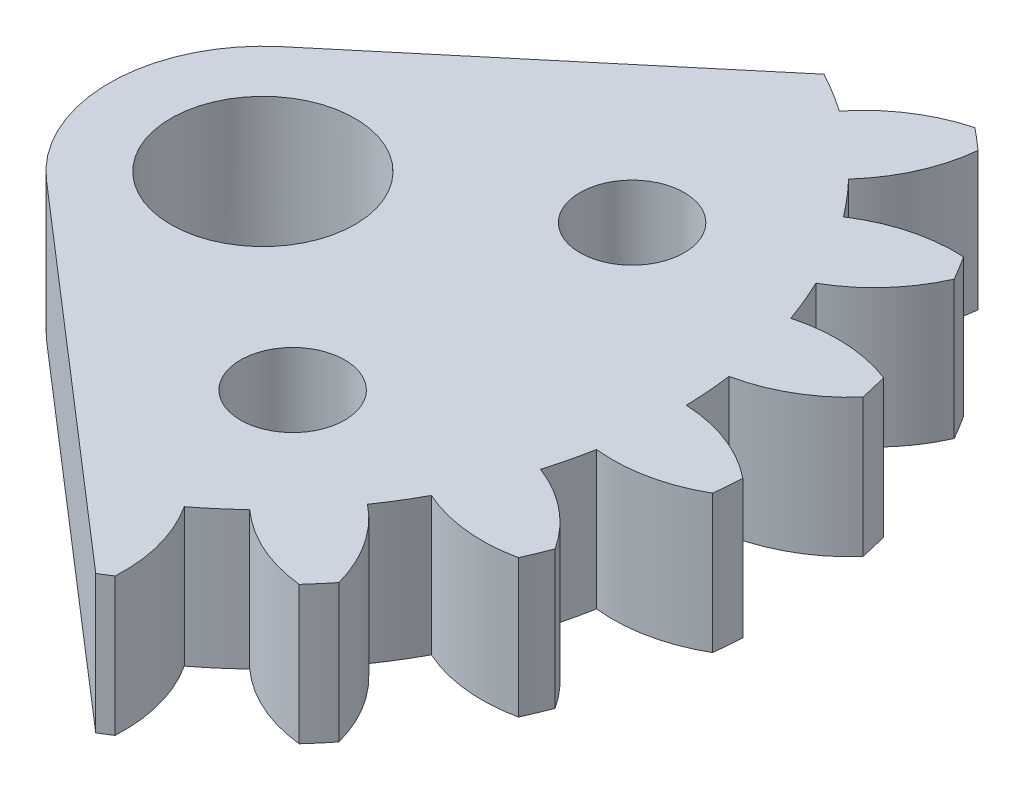
ISO-10303-21;
HEADER;
FILE_DESCRIPTION(('STEP AP214'),'2;1');
FILE_NAME('part.step','',(''),(''),'','','');
FILE_SCHEMA(('AUTOMOTIVE_DESIGN { 1 0 10303 214 1 1 1 1 }'));
ENDSEC;
DATA;
#1=APPLICATION_CONTEXT('core data for automotive mechanical design processes');
#2=APPLICATION_PROTOCOL_DEFINITION('international standard','automotive_design',2000,#1);
#3=PRODUCT_CONTEXT('',#1,'mechanical');
#4=PRODUCT('Part','Part','',(#3));
#5=PRODUCT_RELATED_PRODUCT_CATEGORY('part','',(#4));
#6=PRODUCT_DEFINITION_FORMATION('','',#4);
#7=PRODUCT_DEFINITION_CONTEXT('part definition',#1,'design');
#8=PRODUCT_DEFINITION('design','',#6,#7);
#9=PRODUCT_DEFINITION_SHAPE('','',#8);
#10=(LENGTH_UNIT() NAMED_UNIT(*) SI_UNIT(.MILLI.,.METRE.));
#11=(NAMED_UNIT(*) PLANE_ANGLE_UNIT() SI_UNIT($,.RADIAN.));
#12=(NAMED_UNIT(*) SI_UNIT($,.STERADIAN.) SOLID_ANGLE_UNIT());
#13=UNCERTAINTY_MEASURE_WITH_UNIT(LENGTH_MEASURE(1.E-05),#10,'distance_accuracy_value','');
#14=(GEOMETRIC_REPRESENTATION_CONTEXT(3) GLOBAL_UNCERTAINTY_ASSIGNED_CONTEXT((#13)) GLOBAL_UNIT_ASSIGNED_CONTEXT((#10,
#11,#12)) REPRESENTATION_CONTEXT('',''));
#15=CARTESIAN_POINT('',(0.,0.,0.));
#16=DIRECTION('',(0.,0.,1.));
#17=DIRECTION('',(1.,0.,0.));
#18=AXIS2_PLACEMENT_3D('',#15,#16,#17);
#19=CARTESIAN_POINT('',(0.,0.,0.));
#20=DIRECTION('',(0.,1.,0.));
#21=DIRECTION('',(0.,0.,1.));
#22=AXIS2_PLACEMENT_3D('',#19,#20,#21);
#23=CYLINDRICAL_SURFACE('',#22,10.);
#24=CARTESIAN_POINT('',(0.,3.,0.));
#25=DIRECTION('',(0.,1.,0.));
#26=DIRECTION('',(0.,0.,1.));
#27=AXIS2_PLACEMENT_3D('',#24,#25,#26);
#28=CIRCLE('',#27,10.);
#29=CARTESIAN_POINT('',(-6.42445897078232,3.,-7.66331044214801));
#30=VERTEX_POINT('',#29);
#31=CARTESIAN_POINT('',(-6.54216910554803,3.,7.5630697070973));
#32=VERTEX_POINT('',#31);
#33=EDGE_CURVE('E247',#30,#32,#28,.T.);
#34=ORIENTED_EDGE('',*,*,#33,.T.);
#35=DIRECTION('',(0.,1.,0.));
#36=VECTOR('',#35,1.);
#37=CARTESIAN_POINT('',(-6.54216910554803,0.,7.5630697070973));
#38=LINE('',#37,#36);
#39=CARTESIAN_POINT('',(-6.54216910554804,12.,7.5630697070973));
#40=VERTEX_POINT('',#39);
#41=EDGE_CURVE('E266',#32,#40,#38,.T.);
#42=ORIENTED_EDGE('',*,*,#41,.T.);
#43=CARTESIAN_POINT('',(0.,12.,0.));
#44=DIRECTION('',(0.,1.,0.));
#45=DIRECTION('',(0.,0.,1.));
#46=AXIS2_PLACEMENT_3D('',#43,#44,#45);
#47=CIRCLE('',#46,10.);
#48=CARTESIAN_POINT('',(-6.42445897078232,12.,-7.66331044214801));
#49=VERTEX_POINT('',#48);
#50=EDGE_CURVE('E490',#49,#40,#47,.T.);
#51=ORIENTED_EDGE('',*,*,#50,.F.);
#52=DIRECTION('',(0.,-1.,0.));
#53=VECTOR('',#52,1.);
#54=CARTESIAN_POINT('',(-6.42445897078232,12.,-7.66331044214801));
#55=LINE('',#54,#53);
#56=EDGE_CURVE('E267',#49,#30,#55,.T.);
#57=ORIENTED_EDGE('',*,*,#56,.T.);
#58=EDGE_LOOP('',(#34,#42,#51,#57));
#59=FACE_BOUND('',#58,.T.);
#60=ADVANCED_FACE('F46',(#59),#23,.T.);
#61=CARTESIAN_POINT('',(0.,0.,0.));
#62=DIRECTION('',(0.,1.,0.));
#63=DIRECTION('',(0.,0.,1.));
#64=AXIS2_PLACEMENT_3D('',#61,#62,#63);
#65=CYLINDRICAL_SURFACE('',#64,33.);
#66=DIRECTION('',(0.,1.,0.));
#67=VECTOR('',#66,1.);
#68=CARTESIAN_POINT('',(17.2424526356263,0.,28.1371254236851));
#69=LINE('',#68,#67);
#70=CARTESIAN_POINT('',(17.2424526356263,12.,28.1371254236851));
#71=VERTEX_POINT('',#70);
#72=CARTESIAN_POINT('',(17.2424526356263,3.,28.1371254236851));
#73=VERTEX_POINT('',#72);
#74=EDGE_CURVE('E11',#71,#73,#69,.F.);
#75=ORIENTED_EDGE('',*,*,#74,.T.);
#76=CARTESIAN_POINT('',(0.,3.,0.));
#77=DIRECTION('',(0.,-1.,0.));
#78=DIRECTION('',(0.,0.,-1.));
#79=AXIS2_PLACEMENT_3D('',#76,#77,#78);
#80=CIRCLE('',#79,33.);
#81=CARTESIAN_POINT('',(18.0163227137286,3.,27.6480038316474));
#82=VERTEX_POINT('',#81);
#83=EDGE_CURVE('E355',#82,#73,#80,.T.);
#84=ORIENTED_EDGE('',*,*,#83,.F.);
#85=DIRECTION('',(0.,1.,0.));
#86=VECTOR('',#85,1.);
#87=CARTESIAN_POINT('',(18.0163227137286,0.,27.6480038316474));
#88=LINE('',#87,#86);
#89=CARTESIAN_POINT('',(18.0163227137286,12.,27.6480038316474));
#90=VERTEX_POINT('',#89);
#91=EDGE_CURVE('E337',#82,#90,#88,.T.);
#92=ORIENTED_EDGE('',*,*,#91,.T.);
#93=CARTESIAN_POINT('',(0.,12.,0.));
#94=DIRECTION('',(0.,1.,0.));
#95=DIRECTION('',(0.,0.,1.));
#96=AXIS2_PLACEMENT_3D('',#93,#94,#95);
#97=CIRCLE('',#96,33.);
#98=EDGE_CURVE('E354',#71,#90,#97,.T.);
#99=ORIENTED_EDGE('',*,*,#98,.F.);
#100=EDGE_LOOP('',(#75,#84,#92,#99));
#101=FACE_BOUND('',#100,.T.);
#102=ADVANCED_FACE('F353',(#101),#65,.T.);
#103=CARTESIAN_POINT('',(0.,10.,0.));
#104=DIRECTION('',(0.,-1.,0.));
#105=DIRECTION('',(0.,0.,-1.));
#106=AXIS2_PLACEMENT_3D('',#103,#104,#105);
#107=CYLINDRICAL_SURFACE('',#106,27.);
#108=CARTESIAN_POINT('',(0.,3.,0.));
#109=DIRECTION('',(0.,-1.,0.));
#110=DIRECTION('',(0.,0.,-1.));
#111=AXIS2_PLACEMENT_3D('',#108,#109,#110);
#112=CIRCLE('',#111,27.);
#113=CARTESIAN_POINT('',(12.7950258403905,3.,-23.7757715698932));
#114=VERTEX_POINT('',#113);
#115=CARTESIAN_POINT('',(15.3755474109278,3.,-22.1944259176558));
#116=VERTEX_POINT('',#115);
#117=EDGE_CURVE('E244',#114,#116,#112,.T.);
#118=ORIENTED_EDGE('',*,*,#117,.F.);
#119=DIRECTION('',(0.,-1.,0.));
#120=VECTOR('',#119,1.);
#121=CARTESIAN_POINT('',(12.7950258403905,12.,-23.7757715698932));
#122=LINE('',#121,#120);
#123=CARTESIAN_POINT('',(12.7950258403905,12.,-23.7757715698932));
#124=VERTEX_POINT('',#123);
#125=EDGE_CURVE('E258',#124,#114,#122,.T.);
#126=ORIENTED_EDGE('',*,*,#125,.F.);
#127=CARTESIAN_POINT('',(0.,12.,0.));
#128=DIRECTION('',(0.,1.,0.));
#129=DIRECTION('',(0.,0.,1.));
#130=AXIS2_PLACEMENT_3D('',#127,#128,#129);
#131=CIRCLE('',#130,27.);
#132=CARTESIAN_POINT('',(15.3755474109279,12.,-22.1944259176558));
#133=VERTEX_POINT('',#132);
#134=EDGE_CURVE('E470',#133,#124,#131,.T.);
#135=ORIENTED_EDGE('',*,*,#134,.F.);
#136=DIRECTION('',(0.,1.,0.));
#137=VECTOR('',#136,1.);
#138=CARTESIAN_POINT('',(15.3755474109278,0.,-22.1944259176558));
#139=LINE('',#138,#137);
#140=EDGE_CURVE('E259',#116,#133,#139,.T.);
#141=ORIENTED_EDGE('',*,*,#140,.F.);
#142=EDGE_LOOP('',(#118,#126,#135,#141));
#143=FACE_BOUND('',#142,.T.);
#144=ADVANCED_FACE('F48',(#143),#107,.T.);
#145=CARTESIAN_POINT('',(0.,3.,0.));
#146=DIRECTION('',(0.,-1.,0.));
#147=DIRECTION('',(0.,0.,-1.));
#148=AXIS2_PLACEMENT_3D('',#145,#146,#147);
#149=CIRCLE('',#148,27.);
#150=CARTESIAN_POINT('',(19.5159101711419,3.,-18.6582220533447));
#151=VERTEX_POINT('',#150);
#152=CARTESIAN_POINT('',(21.4814693457194,3.,-16.3568479466221));
#153=VERTEX_POINT('',#152);
#154=EDGE_CURVE('E563',#151,#153,#149,.T.);
#155=ORIENTED_EDGE('',*,*,#154,.F.);
#156=DIRECTION('',(0.,1.,0.));
#157=VECTOR('',#156,1.);
#158=CARTESIAN_POINT('',(19.5159101711419,0.,-18.6582220533447));
#159=LINE('',#158,#157);
#160=CARTESIAN_POINT('',(19.5159101711419,12.,-18.6582220533447));
#161=VERTEX_POINT('',#160);
#162=EDGE_CURVE('E279',#151,#161,#159,.T.);
#163=ORIENTED_EDGE('',*,*,#162,.T.);
#164=CARTESIAN_POINT('',(0.,12.,0.));
#165=DIRECTION('',(0.,1.,0.));
#166=DIRECTION('',(0.,0.,1.));
#167=AXIS2_PLACEMENT_3D('',#164,#165,#166);
#168=CIRCLE('',#167,27.);
#169=CARTESIAN_POINT('',(21.4814693457194,12.,-16.3568479466221));
#170=VERTEX_POINT('',#169);
#171=EDGE_CURVE('E454',#170,#161,#168,.T.);
#172=ORIENTED_EDGE('',*,*,#171,.F.);
#173=DIRECTION('',(0.,1.,0.));
#174=VECTOR('',#173,1.);
#175=CARTESIAN_POINT('',(21.4814693457194,0.,-16.3568479466221));
#176=LINE('',#175,#174);
#177=EDGE_CURVE('E293',#153,#170,#176,.T.);
#178=ORIENTED_EDGE('',*,*,#177,.F.);
#179=EDGE_LOOP('',(#155,#163,#172,#178));
#180=FACE_BOUND('',#179,.T.);
#181=ADVANCED_FACE('F708',(#180),#107,.T.);
#182=CARTESIAN_POINT('',(0.,3.,0.));
#183=DIRECTION('',(0.,-1.,0.));
#184=DIRECTION('',(0.,0.,-1.));
#185=AXIS2_PLACEMENT_3D('',#182,#183,#184);
#186=CIRCLE('',#185,27.);
#187=CARTESIAN_POINT('',(24.3264412390003,3.,-11.7142757627377));
#188=VERTEX_POINT('',#187);
#189=CARTESIAN_POINT('',(25.4846353907543,3.,-8.91814773371219));
#190=VERTEX_POINT('',#189);
#191=EDGE_CURVE('E551',#188,#190,#186,.T.);
#192=ORIENTED_EDGE('',*,*,#191,.F.);
#193=DIRECTION('',(0.,1.,0.));
#194=VECTOR('',#193,1.);
#195=CARTESIAN_POINT('',(24.3264412390003,0.,-11.7142757627377));
#196=LINE('',#195,#194);
#197=CARTESIAN_POINT('',(24.3264412390004,12.,-11.7142757627377));
#198=VERTEX_POINT('',#197);
#199=EDGE_CURVE('E290',#188,#198,#196,.T.);
#200=ORIENTED_EDGE('',*,*,#199,.T.);
#201=CARTESIAN_POINT('',(0.,12.,0.));
#202=DIRECTION('',(0.,1.,0.));
#203=DIRECTION('',(0.,0.,1.));
#204=AXIS2_PLACEMENT_3D('',#201,#202,#203);
#205=CIRCLE('',#204,27.);
#206=CARTESIAN_POINT('',(25.4846353907542,12.,-8.9181477337122));
#207=VERTEX_POINT('',#206);
#208=EDGE_CURVE('E438',#207,#198,#205,.T.);
#209=ORIENTED_EDGE('',*,*,#208,.F.);
#210=DIRECTION('',(0.,1.,0.));
#211=VECTOR('',#210,1.);
#212=CARTESIAN_POINT('',(25.4846353907543,0.,-8.91814773371219));
#213=LINE('',#212,#211);
#214=EDGE_CURVE('E305',#190,#207,#213,.T.);
#215=ORIENTED_EDGE('',*,*,#214,.F.);
#216=EDGE_LOOP('',(#192,#200,#209,#215));
#217=FACE_BOUND('',#216,.T.);
#218=ADVANCED_FACE('F712',(#217),#107,.T.);
#219=CARTESIAN_POINT('',(0.,3.,0.));
#220=DIRECTION('',(0.,-1.,0.));
#221=DIRECTION('',(0.,0.,-1.));
#222=AXIS2_PLACEMENT_3D('',#219,#220,#221);
#223=CIRCLE('',#222,27.);
#224=CARTESIAN_POINT('',(26.7557307461029,3.,-3.62365454231539));
#225=VERTEX_POINT('',#224);
#226=CARTESIAN_POINT('',(26.9931877618464,3.,-0.606477084237547));
#227=VERTEX_POINT('',#226);
#228=EDGE_CURVE('E539',#225,#227,#223,.T.);
#229=ORIENTED_EDGE('',*,*,#228,.F.);
#230=DIRECTION('',(0.,1.,0.));
#231=VECTOR('',#230,1.);
#232=CARTESIAN_POINT('',(26.7557307461029,0.,-3.62365454231538));
#233=LINE('',#232,#231);
#234=CARTESIAN_POINT('',(26.7557307461029,12.,-3.62365454231538));
#235=VERTEX_POINT('',#234);
#236=EDGE_CURVE('E302',#225,#235,#233,.T.);
#237=ORIENTED_EDGE('',*,*,#236,.T.);
#238=CARTESIAN_POINT('',(0.,12.,0.));
#239=DIRECTION('',(0.,1.,0.));
#240=DIRECTION('',(0.,0.,1.));
#241=AXIS2_PLACEMENT_3D('',#238,#239,#240);
#242=CIRCLE('',#241,27.);
#243=CARTESIAN_POINT('',(26.9931877618464,12.,-0.606477084237537));
#244=VERTEX_POINT('',#243);
#245=EDGE_CURVE('E422',#244,#235,#242,.T.);
#246=ORIENTED_EDGE('',*,*,#245,.F.);
#247=DIRECTION('',(0.,1.,0.));
#248=VECTOR('',#247,1.);
#249=CARTESIAN_POINT('',(26.9931877618464,0.,-0.606477084237547));
#250=LINE('',#249,#248);
#251=EDGE_CURVE('E317',#227,#244,#250,.T.);
#252=ORIENTED_EDGE('',*,*,#251,.F.);
#253=EDGE_LOOP('',(#229,#237,#246,#252));
#254=FACE_BOUND('',#253,.T.);
#255=ADVANCED_FACE('F717',(#254),#107,.T.);
#256=CARTESIAN_POINT('',(0.,3.,0.));
#257=DIRECTION('',(0.,-1.,0.));
#258=DIRECTION('',(0.,0.,-1.));
#259=AXIS2_PLACEMENT_3D('',#256,#257,#258);
#260=CIRCLE('',#259,27.);
#261=CARTESIAN_POINT('',(26.5659829096392,3.,4.82167523219452));
#262=VERTEX_POINT('',#261);
#263=CARTESIAN_POINT('',(25.859458842211,3.,7.76455976781659));
#264=VERTEX_POINT('',#263);
#265=EDGE_CURVE('E527',#262,#264,#260,.T.);
#266=ORIENTED_EDGE('',*,*,#265,.F.);
#267=DIRECTION('',(0.,1.,0.));
#268=VECTOR('',#267,1.);
#269=CARTESIAN_POINT('',(26.5659829096392,0.,4.82167523219452));
#270=LINE('',#269,#268);
#271=CARTESIAN_POINT('',(26.5659829096392,12.,4.82167523219452));
#272=VERTEX_POINT('',#271);
#273=EDGE_CURVE('E314',#262,#272,#270,.T.);
#274=ORIENTED_EDGE('',*,*,#273,.T.);
#275=CARTESIAN_POINT('',(0.,12.,0.));
#276=DIRECTION('',(0.,1.,0.));
#277=DIRECTION('',(0.,0.,1.));
#278=AXIS2_PLACEMENT_3D('',#275,#276,#277);
#279=CIRCLE('',#278,27.);
#280=CARTESIAN_POINT('',(25.859458842211,12.,7.76455976781659));
#281=VERTEX_POINT('',#280);
#282=EDGE_CURVE('E406',#281,#272,#279,.T.);
#283=ORIENTED_EDGE('',*,*,#282,.F.);
#284=DIRECTION('',(0.,1.,0.));
#285=VECTOR('',#284,1.);
#286=CARTESIAN_POINT('',(25.859458842211,0.,7.7645597678166));
#287=LINE('',#286,#285);
#288=EDGE_CURVE('E329',#264,#281,#287,.T.);
#289=ORIENTED_EDGE('',*,*,#288,.F.);
#290=EDGE_LOOP('',(#266,#274,#283,#289));
#291=FACE_BOUND('',#290,.T.);
#292=ADVANCED_FACE('F704',(#291),#107,.T.);
#293=CARTESIAN_POINT('',(0.,3.,0.));
#294=DIRECTION('',(0.,-1.,0.));
#295=DIRECTION('',(0.,0.,-1.));
#296=AXIS2_PLACEMENT_3D('',#293,#294,#295);
#297=CIRCLE('',#296,27.);
#298=CARTESIAN_POINT('',(23.7757715698932,3.,12.7950258403905));
#299=VERTEX_POINT('',#298);
#300=CARTESIAN_POINT('',(22.1944259176558,3.,15.3755474109278));
#301=VERTEX_POINT('',#300);
#302=EDGE_CURVE('E515',#299,#301,#297,.T.);
#303=ORIENTED_EDGE('',*,*,#302,.F.);
#304=DIRECTION('',(0.,1.,0.));
#305=VECTOR('',#304,1.);
#306=CARTESIAN_POINT('',(23.7757715698932,0.,12.7950258403905));
#307=LINE('',#306,#305);
#308=CARTESIAN_POINT('',(23.7757715698932,12.,12.7950258403905));
#309=VERTEX_POINT('',#308);
#310=EDGE_CURVE('E326',#299,#309,#307,.T.);
#311=ORIENTED_EDGE('',*,*,#310,.T.);
#312=CARTESIAN_POINT('',(0.,12.,0.));
#313=DIRECTION('',(0.,1.,0.));
#314=DIRECTION('',(0.,0.,1.));
#315=AXIS2_PLACEMENT_3D('',#312,#313,#314);
#316=CIRCLE('',#315,27.);
#317=CARTESIAN_POINT('',(22.1944259176558,12.,15.3755474109278));
#318=VERTEX_POINT('',#317);
#319=EDGE_CURVE('E390',#318,#309,#316,.T.);
#320=ORIENTED_EDGE('',*,*,#319,.F.);
#321=DIRECTION('',(0.,1.,0.));
#322=VECTOR('',#321,1.);
#323=CARTESIAN_POINT('',(22.1944259176558,0.,15.3755474109278));
#324=LINE('',#323,#322);
#325=EDGE_CURVE('E341',#301,#318,#324,.T.);
#326=ORIENTED_EDGE('',*,*,#325,.F.);
#327=EDGE_LOOP('',(#303,#311,#320,#326));
#328=FACE_BOUND('',#327,.T.);
#329=ADVANCED_FACE('F699',(#328),#107,.T.);
#330=CARTESIAN_POINT('',(0.,3.,0.));
#331=DIRECTION('',(0.,-1.,0.));
#332=DIRECTION('',(0.,0.,-1.));
#333=AXIS2_PLACEMENT_3D('',#330,#331,#332);
#334=CIRCLE('',#333,27.);
#335=CARTESIAN_POINT('',(18.6582220533447,3.,19.515910171142));
#336=VERTEX_POINT('',#335);
#337=CARTESIAN_POINT('',(16.3568479466221,3.,21.4814693457194));
#338=VERTEX_POINT('',#337);
#339=EDGE_CURVE('E501',#336,#338,#334,.T.);
#340=ORIENTED_EDGE('',*,*,#339,.F.);
#341=DIRECTION('',(0.,1.,0.));
#342=VECTOR('',#341,1.);
#343=CARTESIAN_POINT('',(18.6582220533447,0.,19.5159101711419));
#344=LINE('',#343,#342);
#345=CARTESIAN_POINT('',(18.6582220533447,12.,19.515910171142));
#346=VERTEX_POINT('',#345);
#347=EDGE_CURVE('E338',#336,#346,#344,.T.);
#348=ORIENTED_EDGE('',*,*,#347,.T.);
#349=CARTESIAN_POINT('',(0.,12.,0.));
#350=DIRECTION('',(0.,1.,0.));
#351=DIRECTION('',(0.,0.,1.));
#352=AXIS2_PLACEMENT_3D('',#349,#350,#351);
#353=CIRCLE('',#352,27.);
#354=CARTESIAN_POINT('',(16.3568479466221,12.,21.4814693457194));
#355=VERTEX_POINT('',#354);
#356=EDGE_CURVE('E372',#355,#346,#353,.T.);
#357=ORIENTED_EDGE('',*,*,#356,.F.);
#358=DIRECTION('',(0.,1.,0.));
#359=VECTOR('',#358,1.);
#360=CARTESIAN_POINT('',(16.3568479466221,0.,21.4814693457194));
#361=LINE('',#360,#359);
#362=EDGE_CURVE('E56',#338,#355,#361,.T.);
#363=ORIENTED_EDGE('',*,*,#362,.F.);
#364=EDGE_LOOP('',(#340,#348,#357,#363));
#365=FACE_BOUND('',#364,.T.);
#366=ADVANCED_FACE('F695',(#365),#107,.T.);
#367=CARTESIAN_POINT('',(7.7704316782252,0.,27.0987156695216));
#368=DIRECTION('',(0.,1.,0.));
#369=DIRECTION('',(0.,0.,1.));
#370=AXIS2_PLACEMENT_3D('',#367,#368,#369);
#371=CYLINDRICAL_SURFACE('',#370,10.2606042997701);
#372=ORIENTED_EDGE('',*,*,#91,.F.);
#373=CARTESIAN_POINT('',(7.7704316782252,3.,27.0987156695216));
#374=DIRECTION('',(0.,-1.,0.));
#375=DIRECTION('',(0.,0.,-1.));
#376=AXIS2_PLACEMENT_3D('',#373,#374,#375);
#377=CIRCLE('',#376,10.2606042997701);
#378=EDGE_CURVE('E498',#338,#82,#377,.T.);
#379=ORIENTED_EDGE('',*,*,#378,.F.);
#380=ORIENTED_EDGE('',*,*,#362,.T.);
#381=CARTESIAN_POINT('',(7.7704316782252,12.,27.0987156695216));
#382=DIRECTION('',(0.,1.,0.));
#383=DIRECTION('',(0.,0.,1.));
#384=AXIS2_PLACEMENT_3D('',#381,#382,#383);
#385=CIRCLE('',#384,10.2606042997701);
#386=EDGE_CURVE('E363',#90,#355,#385,.T.);
#387=ORIENTED_EDGE('',*,*,#386,.F.);
#388=EDGE_LOOP('',(#372,#379,#380,#387));
#389=FACE_BOUND('',#388,.T.);
#390=ADVANCED_FACE('F369',(#389),#371,.T.);
#391=CARTESIAN_POINT('',(0.,0.,0.));
#392=DIRECTION('',(0.,1.,0.));
#393=DIRECTION('',(0.,0.,1.));
#394=AXIS2_PLACEMENT_3D('',#391,#392,#393);
#395=CYLINDRICAL_SURFACE('',#394,33.);
#396=DIRECTION('',(0.,1.,0.));
#397=VECTOR('',#396,1.);
#398=CARTESIAN_POINT('',(24.4892372195335,0.,22.1196125735831));
#399=LINE('',#398,#397);
#400=CARTESIAN_POINT('',(24.4892372195335,3.,22.1196125735831));
#401=VERTEX_POINT('',#400);
#402=CARTESIAN_POINT('',(24.4892372195335,12.,22.1196125735831));
#403=VERTEX_POINT('',#402);
#404=EDGE_CURVE('E334',#401,#403,#399,.T.);
#405=ORIENTED_EDGE('',*,*,#404,.F.);
#406=CARTESIAN_POINT('',(0.,3.,0.));
#407=DIRECTION('',(0.,-1.,0.));
#408=DIRECTION('',(0.,0.,-1.));
#409=AXIS2_PLACEMENT_3D('',#406,#407,#408);
#410=CIRCLE('',#409,33.);
#411=CARTESIAN_POINT('',(25.6782441610907,3.,20.7274643119561));
#412=VERTEX_POINT('',#411);
#413=EDGE_CURVE('E509',#412,#401,#410,.T.);
#414=ORIENTED_EDGE('',*,*,#413,.F.);
#415=DIRECTION('',(0.,1.,0.));
#416=VECTOR('',#415,1.);
#417=CARTESIAN_POINT('',(25.6782441610907,0.,20.7274643119561));
#418=LINE('',#417,#416);
#419=CARTESIAN_POINT('',(25.6782441610907,12.,20.7274643119561));
#420=VERTEX_POINT('',#419);
#421=EDGE_CURVE('E325',#412,#420,#418,.T.);
#422=ORIENTED_EDGE('',*,*,#421,.T.);
#423=CARTESIAN_POINT('',(0.,12.,0.));
#424=DIRECTION('',(0.,1.,0.));
#425=DIRECTION('',(0.,0.,1.));
#426=AXIS2_PLACEMENT_3D('',#423,#424,#425);
#427=CIRCLE('',#426,33.);
#428=EDGE_CURVE('E382',#403,#420,#427,.T.);
#429=ORIENTED_EDGE('',*,*,#428,.F.);
#430=EDGE_LOOP('',(#405,#414,#422,#429));
#431=FACE_BOUND('',#430,.T.);
#432=ADVANCED_FACE('F686',(#431),#395,.T.);
#433=CARTESIAN_POINT('',(25.5495221891744,0.,11.9139378590131));
#434=DIRECTION('',(0.,1.,0.));
#435=DIRECTION('',(0.,0.,1.));
#436=AXIS2_PLACEMENT_3D('',#433,#434,#435);
#437=CYLINDRICAL_SURFACE('',#436,10.2606042997701);
#438=ORIENTED_EDGE('',*,*,#347,.F.);
#439=CARTESIAN_POINT('',(25.5495221891744,3.,11.9139378590131));
#440=DIRECTION('',(0.,-1.,0.));
#441=DIRECTION('',(0.,0.,-1.));
#442=AXIS2_PLACEMENT_3D('',#439,#440,#441);
#443=CIRCLE('',#442,10.2606042997701);
#444=EDGE_CURVE('E506',#401,#336,#443,.T.);
#445=ORIENTED_EDGE('',*,*,#444,.F.);
#446=ORIENTED_EDGE('',*,*,#404,.T.);
#447=CARTESIAN_POINT('',(25.5495221891744,12.,11.9139378590131));
#448=DIRECTION('',(0.,1.,0.));
#449=DIRECTION('',(0.,0.,1.));
#450=AXIS2_PLACEMENT_3D('',#447,#448,#449);
#451=CIRCLE('',#450,10.2606042997701);
#452=EDGE_CURVE('E375',#346,#403,#451,.T.);
#453=ORIENTED_EDGE('',*,*,#452,.F.);
#454=EDGE_LOOP('',(#438,#445,#446,#453));
#455=FACE_BOUND('',#454,.T.);
#456=ADVANCED_FACE('F683',(#455),#437,.T.);
#457=CARTESIAN_POINT('',(15.7640833496192,0.,23.3712146785271));
#458=DIRECTION('',(0.,1.,0.));
#459=DIRECTION('',(0.,0.,1.));
#460=AXIS2_PLACEMENT_3D('',#457,#458,#459);
#461=CYLINDRICAL_SURFACE('',#460,10.2606042997701);
#462=ORIENTED_EDGE('',*,*,#421,.F.);
#463=CARTESIAN_POINT('',(15.7640833496192,3.,23.3712146785271));
#464=DIRECTION('',(0.,-1.,0.));
#465=DIRECTION('',(0.,0.,-1.));
#466=AXIS2_PLACEMENT_3D('',#463,#464,#465);
#467=CIRCLE('',#466,10.2606042997701);
#468=EDGE_CURVE('E512',#301,#412,#467,.T.);
#469=ORIENTED_EDGE('',*,*,#468,.F.);
#470=ORIENTED_EDGE('',*,*,#325,.T.);
#471=CARTESIAN_POINT('',(15.7640833496192,12.,23.3712146785271));
#472=DIRECTION('',(0.,1.,0.));
#473=DIRECTION('',(0.,0.,1.));
#474=AXIS2_PLACEMENT_3D('',#471,#472,#473);
#475=CIRCLE('',#474,10.2606042997701);
#476=EDGE_CURVE('E386',#420,#318,#475,.T.);
#477=ORIENTED_EDGE('',*,*,#476,.F.);
#478=EDGE_LOOP('',(#462,#469,#470,#477));
#479=FACE_BOUND('',#478,.T.);
#480=ADVANCED_FACE('F681',(#479),#461,.T.);
#481=CARTESIAN_POINT('',(0.,0.,0.));
#482=DIRECTION('',(0.,1.,0.));
#483=DIRECTION('',(0.,0.,1.));
#484=AXIS2_PLACEMENT_3D('',#481,#482,#483);
#485=CYLINDRICAL_SURFACE('',#484,33.);
#486=DIRECTION('',(0.,1.,0.));
#487=VECTOR('',#486,1.);
#488=CARTESIAN_POINT('',(30.1259848309621,0.,13.4694111959151));
#489=LINE('',#488,#487);
#490=CARTESIAN_POINT('',(30.1259848309621,3.,13.4694111959151));
#491=VERTEX_POINT('',#490);
#492=CARTESIAN_POINT('',(30.1259848309621,12.,13.4694111959151));
#493=VERTEX_POINT('',#492);
#494=EDGE_CURVE('E322',#491,#493,#489,.T.);
#495=ORIENTED_EDGE('',*,*,#494,.F.);
#496=CARTESIAN_POINT('',(0.,3.,0.));
#497=DIRECTION('',(0.,-1.,0.));
#498=DIRECTION('',(0.,0.,-1.));
#499=AXIS2_PLACEMENT_3D('',#496,#497,#498);
#500=CIRCLE('',#499,33.);
#501=CARTESIAN_POINT('',(30.8266001591179,3.,11.7779761686748));
#502=VERTEX_POINT('',#501);
#503=EDGE_CURVE('E521',#502,#491,#500,.T.);
#504=ORIENTED_EDGE('',*,*,#503,.F.);
#505=DIRECTION('',(0.,1.,0.));
#506=VECTOR('',#505,1.);
#507=CARTESIAN_POINT('',(30.8266001591179,0.,11.7779761686748));
#508=LINE('',#507,#506);
#509=CARTESIAN_POINT('',(30.8266001591179,12.,11.7779761686748));
#510=VERTEX_POINT('',#509);
#511=EDGE_CURVE('E313',#502,#510,#508,.T.);
#512=ORIENTED_EDGE('',*,*,#511,.T.);
#513=CARTESIAN_POINT('',(0.,12.,0.));
#514=DIRECTION('',(0.,1.,0.));
#515=DIRECTION('',(0.,0.,1.));
#516=AXIS2_PLACEMENT_3D('',#513,#514,#515);
#517=CIRCLE('',#516,33.);
#518=EDGE_CURVE('E398',#493,#510,#517,.T.);
#519=ORIENTED_EDGE('',*,*,#518,.F.);
#520=EDGE_LOOP('',(#495,#504,#512,#519));
#521=FACE_BOUND('',#520,.T.);
#522=ADVANCED_FACE('F674',(#521),#485,.T.);
#523=CARTESIAN_POINT('',(27.980648834604,0.,3.43559168093522));
#524=DIRECTION('',(0.,1.,0.));
#525=DIRECTION('',(0.,0.,1.));
#526=AXIS2_PLACEMENT_3D('',#523,#524,#525);
#527=CYLINDRICAL_SURFACE('',#526,10.2606042997701);
#528=ORIENTED_EDGE('',*,*,#310,.F.);
#529=CARTESIAN_POINT('',(27.980648834604,3.,3.43559168093522));
#530=DIRECTION('',(0.,-1.,0.));
#531=DIRECTION('',(0.,0.,-1.));
#532=AXIS2_PLACEMENT_3D('',#529,#530,#531);
#533=CIRCLE('',#532,10.2606042997701);
#534=EDGE_CURVE('E518',#491,#299,#533,.T.);
#535=ORIENTED_EDGE('',*,*,#534,.F.);
#536=ORIENTED_EDGE('',*,*,#494,.T.);
#537=CARTESIAN_POINT('',(27.980648834604,12.,3.43559168093522));
#538=DIRECTION('',(0.,1.,0.));
#539=DIRECTION('',(0.,0.,1.));
#540=AXIS2_PLACEMENT_3D('',#537,#538,#539);
#541=CIRCLE('',#540,10.2606042997701);
#542=EDGE_CURVE('E394',#309,#493,#541,.T.);
#543=ORIENTED_EDGE('',*,*,#542,.F.);
#544=EDGE_LOOP('',(#528,#535,#536,#543));
#545=FACE_BOUND('',#544,.T.);
#546=ADVANCED_FACE('F671',(#545),#527,.T.);
#547=CARTESIAN_POINT('',(22.2146367079254,0.,17.3559763579706));
#548=DIRECTION('',(0.,1.,0.));
#549=DIRECTION('',(0.,0.,1.));
#550=AXIS2_PLACEMENT_3D('',#547,#548,#549);
#551=CYLINDRICAL_SURFACE('',#550,10.2606042997701);
#552=ORIENTED_EDGE('',*,*,#511,.F.);
#553=CARTESIAN_POINT('',(22.2146367079254,3.,17.3559763579706));
#554=DIRECTION('',(0.,-1.,0.));
#555=DIRECTION('',(0.,0.,-1.));
#556=AXIS2_PLACEMENT_3D('',#553,#554,#555);
#557=CIRCLE('',#556,10.2606042997701);
#558=EDGE_CURVE('E524',#264,#502,#557,.T.);
#559=ORIENTED_EDGE('',*,*,#558,.F.);
#560=ORIENTED_EDGE('',*,*,#288,.T.);
#561=CARTESIAN_POINT('',(22.2146367079254,12.,17.3559763579706));
#562=DIRECTION('',(0.,1.,0.));
#563=DIRECTION('',(0.,0.,1.));
#564=AXIS2_PLACEMENT_3D('',#561,#562,#563);
#565=CIRCLE('',#564,10.2606042997701);
#566=EDGE_CURVE('E402',#510,#281,#565,.T.);
#567=ORIENTED_EDGE('',*,*,#566,.F.);
#568=EDGE_LOOP('',(#552,#559,#560,#567));
#569=FACE_BOUND('',#568,.T.);
#570=ADVANCED_FACE('F669',(#569),#551,.T.);
#571=CARTESIAN_POINT('',(0.,0.,0.));
#572=DIRECTION('',(0.,1.,0.));
#573=DIRECTION('',(0.,0.,1.));
#574=AXIS2_PLACEMENT_3D('',#571,#572,#573);
#575=CYLINDRICAL_SURFACE('',#574,33.);
#576=DIRECTION('',(0.,1.,0.));
#577=VECTOR('',#576,1.);
#578=CARTESIAN_POINT('',(32.8137911470574,0.,3.50073000348476));
#579=LINE('',#578,#577);
#580=CARTESIAN_POINT('',(32.8137911470574,3.,3.50073000348476));
#581=VERTEX_POINT('',#580);
#582=CARTESIAN_POINT('',(32.8137911470574,12.,3.50073000348477));
#583=VERTEX_POINT('',#582);
#584=EDGE_CURVE('E310',#581,#583,#579,.T.);
#585=ORIENTED_EDGE('',*,*,#584,.F.);
#586=CARTESIAN_POINT('',(0.,3.,0.));
#587=DIRECTION('',(0.,-1.,0.));
#588=DIRECTION('',(0.,0.,-1.));
#589=AXIS2_PLACEMENT_3D('',#586,#587,#588);
#590=CIRCLE('',#589,33.);
#591=CARTESIAN_POINT('',(32.957433752018,3.,1.67557765601832));
#592=VERTEX_POINT('',#591);
#593=EDGE_CURVE('E533',#592,#581,#590,.T.);
#594=ORIENTED_EDGE('',*,*,#593,.F.);
#595=DIRECTION('',(0.,1.,0.));
#596=VECTOR('',#595,1.);
#597=CARTESIAN_POINT('',(32.957433752018,0.,1.67557765601832));
#598=LINE('',#597,#596);
#599=CARTESIAN_POINT('',(32.957433752018,12.,1.67557765601833));
#600=VERTEX_POINT('',#599);
#601=EDGE_CURVE('E301',#592,#600,#598,.T.);
#602=ORIENTED_EDGE('',*,*,#601,.T.);
#603=CARTESIAN_POINT('',(0.,12.,0.));
#604=DIRECTION('',(0.,1.,0.));
#605=DIRECTION('',(0.,0.,1.));
#606=AXIS2_PLACEMENT_3D('',#603,#604,#605);
#607=CIRCLE('',#606,33.);
#608=EDGE_CURVE('E414',#583,#600,#607,.T.);
#609=ORIENTED_EDGE('',*,*,#608,.F.);
#610=EDGE_LOOP('',(#585,#594,#602,#609));
#611=FACE_BOUND('',#610,.T.);
#612=ADVANCED_FACE('F662',(#611),#575,.T.);
#613=CARTESIAN_POINT('',(27.6728346194587,0.,-5.37905414804736));
#614=DIRECTION('',(0.,1.,0.));
#615=DIRECTION('',(0.,0.,1.));
#616=AXIS2_PLACEMENT_3D('',#613,#614,#615);
#617=CYLINDRICAL_SURFACE('',#616,10.2606042997701);
#618=ORIENTED_EDGE('',*,*,#273,.F.);
#619=CARTESIAN_POINT('',(27.6728346194587,3.,-5.37905414804736));
#620=DIRECTION('',(0.,-1.,0.));
#621=DIRECTION('',(0.,0.,-1.));
#622=AXIS2_PLACEMENT_3D('',#619,#620,#621);
#623=CIRCLE('',#622,10.2606042997701);
#624=EDGE_CURVE('E530',#581,#262,#623,.T.);
#625=ORIENTED_EDGE('',*,*,#624,.F.);
#626=ORIENTED_EDGE('',*,*,#584,.T.);
#627=CARTESIAN_POINT('',(27.6728346194587,12.,-5.37905414804736));
#628=DIRECTION('',(0.,1.,0.));
#629=DIRECTION('',(0.,0.,1.));
#630=AXIS2_PLACEMENT_3D('',#627,#628,#629);
#631=CIRCLE('',#630,10.2606042997701);
#632=EDGE_CURVE('E410',#272,#583,#631,.T.);
#633=ORIENTED_EDGE('',*,*,#632,.F.);
#634=EDGE_LOOP('',(#618,#625,#626,#633));
#635=FACE_BOUND('',#634,.T.);
#636=ADVANCED_FACE('F659',(#635),#617,.T.);
#637=CARTESIAN_POINT('',(26.4906666467847,0.,9.64181414529811));
#638=DIRECTION('',(0.,1.,0.));
#639=DIRECTION('',(0.,0.,1.));
#640=AXIS2_PLACEMENT_3D('',#637,#638,#639);
#641=CYLINDRICAL_SURFACE('',#640,10.2606042997701);
#642=ORIENTED_EDGE('',*,*,#601,.F.);
#643=CARTESIAN_POINT('',(26.4906666467847,3.,9.64181414529811));
#644=DIRECTION('',(0.,-1.,0.));
#645=DIRECTION('',(0.,0.,-1.));
#646=AXIS2_PLACEMENT_3D('',#643,#644,#645);
#647=CIRCLE('',#646,10.2606042997701);
#648=EDGE_CURVE('E536',#227,#592,#647,.T.);
#649=ORIENTED_EDGE('',*,*,#648,.F.);
#650=ORIENTED_EDGE('',*,*,#251,.T.);
#651=CARTESIAN_POINT('',(26.4906666467847,12.,9.64181414529811));
#652=DIRECTION('',(0.,1.,0.));
#653=DIRECTION('',(0.,0.,1.));
#654=AXIS2_PLACEMENT_3D('',#651,#652,#653);
#655=CIRCLE('',#654,10.2606042997701);
#656=EDGE_CURVE('E418',#600,#244,#655,.T.);
#657=ORIENTED_EDGE('',*,*,#656,.F.);
#658=EDGE_LOOP('',(#642,#649,#650,#657));
#659=FACE_BOUND('',#658,.T.);
#660=ADVANCED_FACE('F657',(#659),#641,.T.);
#661=CARTESIAN_POINT('',(0.,0.,0.));
#662=DIRECTION('',(0.,1.,0.));
#663=DIRECTION('',(0.,0.,1.));
#664=AXIS2_PLACEMENT_3D('',#661,#662,#663);
#665=CYLINDRICAL_SURFACE('',#664,33.);
#666=DIRECTION('',(0.,1.,0.));
#667=VECTOR('',#666,1.);
#668=CARTESIAN_POINT('',(32.2895549585522,0.,-6.81062703270679));
#669=LINE('',#668,#667);
#670=CARTESIAN_POINT('',(32.2895549585522,3.,-6.81062703270682));
#671=VERTEX_POINT('',#670);
#672=CARTESIAN_POINT('',(32.2895549585522,12.,-6.81062703270678));
#673=VERTEX_POINT('',#672);
#674=EDGE_CURVE('E298',#671,#673,#669,.T.);
#675=ORIENTED_EDGE('',*,*,#674,.F.);
#676=CARTESIAN_POINT('',(0.,3.,0.));
#677=DIRECTION('',(0.,-1.,0.));
#678=DIRECTION('',(0.,0.,-1.));
#679=AXIS2_PLACEMENT_3D('',#676,#677,#678);
#680=CIRCLE('',#679,33.);
#681=CARTESIAN_POINT('',(31.8621641013271,3.,-8.59083807204526));
#682=VERTEX_POINT('',#681);
#683=EDGE_CURVE('E545',#682,#671,#680,.T.);
#684=ORIENTED_EDGE('',*,*,#683,.F.);
#685=DIRECTION('',(0.,1.,0.));
#686=VECTOR('',#685,1.);
#687=CARTESIAN_POINT('',(31.8621641013271,0.,-8.59083807204527));
#688=LINE('',#687,#686);
#689=CARTESIAN_POINT('',(31.8621641013271,12.,-8.59083807204527));
#690=VERTEX_POINT('',#689);
#691=EDGE_CURVE('E289',#682,#690,#688,.T.);
#692=ORIENTED_EDGE('',*,*,#691,.T.);
#693=CARTESIAN_POINT('',(0.,12.,0.));
#694=DIRECTION('',(0.,1.,0.));
#695=DIRECTION('',(0.,0.,1.));
#696=AXIS2_PLACEMENT_3D('',#693,#694,#695);
#697=CIRCLE('',#696,33.);
#698=EDGE_CURVE('E430',#673,#690,#697,.T.);
#699=ORIENTED_EDGE('',*,*,#698,.F.);
#700=EDGE_LOOP('',(#675,#684,#692,#699));
#701=FACE_BOUND('',#700,.T.);
#702=ADVANCED_FACE('F650',(#701),#665,.T.);
#703=CARTESIAN_POINT('',(24.6562105437847,0.,-13.667160678945));
#704=DIRECTION('',(0.,1.,0.));
#705=DIRECTION('',(0.,0.,1.));
#706=AXIS2_PLACEMENT_3D('',#703,#704,#705);
#707=CYLINDRICAL_SURFACE('',#706,10.2606042997701);
#708=ORIENTED_EDGE('',*,*,#236,.F.);
#709=CARTESIAN_POINT('',(24.6562105437847,3.,-13.667160678945));
#710=DIRECTION('',(0.,-1.,0.));
#711=DIRECTION('',(0.,0.,-1.));
#712=AXIS2_PLACEMENT_3D('',#709,#710,#711);
#713=CIRCLE('',#712,10.2606042997701);
#714=EDGE_CURVE('E542',#671,#225,#713,.T.);
#715=ORIENTED_EDGE('',*,*,#714,.F.);
#716=ORIENTED_EDGE('',*,*,#674,.T.);
#717=CARTESIAN_POINT('',(24.6562105437847,12.,-13.667160678945));
#718=DIRECTION('',(0.,1.,0.));
#719=DIRECTION('',(0.,0.,1.));
#720=AXIS2_PLACEMENT_3D('',#717,#718,#719);
#721=CIRCLE('',#720,10.2606042997701);
#722=EDGE_CURVE('E426',#235,#673,#721,.T.);
#723=ORIENTED_EDGE('',*,*,#722,.F.);
#724=EDGE_LOOP('',(#708,#715,#716,#723));
#725=FACE_BOUND('',#724,.T.);
#726=ADVANCED_FACE('F647',(#725),#707,.T.);
#727=CARTESIAN_POINT('',(28.1736055629291,0.,0.98384398561449));
#728=DIRECTION('',(0.,1.,0.));
#729=DIRECTION('',(0.,0.,1.));
#730=AXIS2_PLACEMENT_3D('',#727,#728,#729);
#731=CYLINDRICAL_SURFACE('',#730,10.2606042997701);
#732=ORIENTED_EDGE('',*,*,#691,.F.);
#733=CARTESIAN_POINT('',(28.1736055629291,3.,0.98384398561449));
#734=DIRECTION('',(0.,-1.,0.));
#735=DIRECTION('',(0.,0.,-1.));
#736=AXIS2_PLACEMENT_3D('',#733,#734,#735);
#737=CIRCLE('',#736,10.2606042997701);
#738=EDGE_CURVE('E548',#190,#682,#737,.T.);
#739=ORIENTED_EDGE('',*,*,#738,.F.);
#740=ORIENTED_EDGE('',*,*,#214,.T.);
#741=CARTESIAN_POINT('',(28.1736055629291,12.,0.98384398561449));
#742=DIRECTION('',(0.,1.,0.));
#743=DIRECTION('',(0.,0.,1.));
#744=AXIS2_PLACEMENT_3D('',#741,#742,#743);
#745=CIRCLE('',#744,10.2606042997701);
#746=EDGE_CURVE('E434',#690,#207,#745,.T.);
#747=ORIENTED_EDGE('',*,*,#746,.F.);
#748=EDGE_LOOP('',(#732,#739,#740,#747));
#749=FACE_BOUND('',#748,.T.);
#750=ADVANCED_FACE('F645',(#749),#731,.T.);
#751=CARTESIAN_POINT('',(0.,0.,0.));
#752=DIRECTION('',(0.,1.,0.));
#753=DIRECTION('',(0.,0.,1.));
#754=AXIS2_PLACEMENT_3D('',#751,#752,#753);
#755=CYLINDRICAL_SURFACE('',#754,33.);
#756=DIRECTION('',(0.,1.,0.));
#757=VECTOR('',#756,1.);
#758=CARTESIAN_POINT('',(28.6045921561457,0.,-16.4553124425082));
#759=LINE('',#758,#757);
#760=CARTESIAN_POINT('',(28.6045921561457,3.,-16.4553124425082));
#761=VERTEX_POINT('',#760);
#762=CARTESIAN_POINT('',(28.6045921561457,12.,-16.4553124425082));
#763=VERTEX_POINT('',#762);
#764=EDGE_CURVE('E286',#761,#763,#759,.T.);
#765=ORIENTED_EDGE('',*,*,#764,.F.);
#766=CARTESIAN_POINT('',(0.,3.,0.));
#767=DIRECTION('',(0.,-1.,0.));
#768=DIRECTION('',(0.,0.,-1.));
#769=AXIS2_PLACEMENT_3D('',#766,#767,#768);
#770=CIRCLE('',#769,33.);
#771=CARTESIAN_POINT('',(27.6480038316474,3.,-18.0163227137286));
#772=VERTEX_POINT('',#771);
#773=EDGE_CURVE('E557',#772,#761,#770,.T.);
#774=ORIENTED_EDGE('',*,*,#773,.F.);
#775=DIRECTION('',(0.,1.,0.));
#776=VECTOR('',#775,1.);
#777=CARTESIAN_POINT('',(27.6480038316474,0.,-18.0163227137286));
#778=LINE('',#777,#776);
#779=CARTESIAN_POINT('',(27.6480038316474,12.,-18.0163227137286));
#780=VERTEX_POINT('',#779);
#781=EDGE_CURVE('E278',#772,#780,#778,.T.);
#782=ORIENTED_EDGE('',*,*,#781,.T.);
#783=CARTESIAN_POINT('',(0.,12.,0.));
#784=DIRECTION('',(0.,1.,0.));
#785=DIRECTION('',(0.,0.,1.));
#786=AXIS2_PLACEMENT_3D('',#783,#784,#785);
#787=CIRCLE('',#786,33.);
#788=EDGE_CURVE('E446',#763,#780,#787,.T.);
#789=ORIENTED_EDGE('',*,*,#788,.F.);
#790=EDGE_LOOP('',(#765,#774,#782,#789));
#791=FACE_BOUND('',#790,.T.);
#792=ADVANCED_FACE('F638',(#791),#755,.T.);
#793=CARTESIAN_POINT('',(19.2260647901646,0.,-20.6174302978798));
#794=DIRECTION('',(0.,1.,0.));
#795=DIRECTION('',(0.,0.,1.));
#796=AXIS2_PLACEMENT_3D('',#793,#794,#795);
#797=CYLINDRICAL_SURFACE('',#796,10.2606042997701);
#798=ORIENTED_EDGE('',*,*,#199,.F.);
#799=CARTESIAN_POINT('',(19.2260647901646,3.,-20.6174302978798));
#800=DIRECTION('',(0.,-1.,0.));
#801=DIRECTION('',(0.,0.,-1.));
#802=AXIS2_PLACEMENT_3D('',#799,#800,#801);
#803=CIRCLE('',#802,10.2606042997701);
#804=EDGE_CURVE('E554',#761,#188,#803,.T.);
#805=ORIENTED_EDGE('',*,*,#804,.F.);
#806=ORIENTED_EDGE('',*,*,#764,.T.);
#807=CARTESIAN_POINT('',(19.2260647901646,12.,-20.6174302978798));
#808=DIRECTION('',(0.,1.,0.));
#809=DIRECTION('',(0.,0.,1.));
#810=AXIS2_PLACEMENT_3D('',#807,#808,#809);
#811=CIRCLE('',#810,10.2606042997701);
#812=EDGE_CURVE('E442',#198,#763,#811,.T.);
#813=ORIENTED_EDGE('',*,*,#812,.F.);
#814=EDGE_LOOP('',(#798,#805,#806,#813));
#815=FACE_BOUND('',#814,.T.);
#816=ADVANCED_FACE('F635',(#815),#797,.T.);
#817=CARTESIAN_POINT('',(27.0987156695216,0.,-7.7704316782252));
#818=DIRECTION('',(0.,1.,0.));
#819=DIRECTION('',(0.,0.,1.));
#820=AXIS2_PLACEMENT_3D('',#817,#818,#819);
#821=CYLINDRICAL_SURFACE('',#820,10.2606042997701);
#822=ORIENTED_EDGE('',*,*,#781,.F.);
#823=CARTESIAN_POINT('',(27.0987156695216,3.,-7.7704316782252));
#824=DIRECTION('',(0.,-1.,0.));
#825=DIRECTION('',(0.,0.,-1.));
#826=AXIS2_PLACEMENT_3D('',#823,#824,#825);
#827=CIRCLE('',#826,10.2606042997701);
#828=EDGE_CURVE('E560',#153,#772,#827,.T.);
#829=ORIENTED_EDGE('',*,*,#828,.F.);
#830=ORIENTED_EDGE('',*,*,#177,.T.);
#831=CARTESIAN_POINT('',(27.0987156695216,12.,-7.7704316782252));
#832=DIRECTION('',(0.,1.,0.));
#833=DIRECTION('',(0.,0.,1.));
#834=AXIS2_PLACEMENT_3D('',#831,#832,#833);
#835=CIRCLE('',#834,10.2606042997701);
#836=EDGE_CURVE('E450',#780,#170,#835,.T.);
#837=ORIENTED_EDGE('',*,*,#836,.F.);
#838=EDGE_LOOP('',(#822,#829,#830,#837));
#839=FACE_BOUND('',#838,.T.);
#840=ADVANCED_FACE('F633',(#839),#821,.T.);
#841=CARTESIAN_POINT('',(0.,0.,0.));
#842=DIRECTION('',(0.,1.,0.));
#843=DIRECTION('',(0.,0.,1.));
#844=AXIS2_PLACEMENT_3D('',#841,#842,#843);
#845=CYLINDRICAL_SURFACE('',#844,33.);
#846=DIRECTION('',(0.,1.,0.));
#847=VECTOR('',#846,1.);
#848=CARTESIAN_POINT('',(22.1196125735831,0.,-24.4892372195335));
#849=LINE('',#848,#847);
#850=CARTESIAN_POINT('',(22.1196125735831,3.,-24.4892372195335));
#851=VERTEX_POINT('',#850);
#852=CARTESIAN_POINT('',(22.1196125735831,12.,-24.4892372195335));
#853=VERTEX_POINT('',#852);
#854=EDGE_CURVE('E275',#851,#853,#849,.T.);
#855=ORIENTED_EDGE('',*,*,#854,.F.);
#856=CARTESIAN_POINT('',(0.,3.,0.));
#857=DIRECTION('',(0.,-1.,0.));
#858=DIRECTION('',(0.,0.,-1.));
#859=AXIS2_PLACEMENT_3D('',#856,#857,#858);
#860=CIRCLE('',#859,33.);
#861=CARTESIAN_POINT('',(20.7274643119561,3.,-25.6782441610907));
#862=VERTEX_POINT('',#861);
#863=EDGE_CURVE('E569',#862,#851,#860,.T.);
#864=ORIENTED_EDGE('',*,*,#863,.F.);
#865=DIRECTION('',(0.,1.,0.));
#866=VECTOR('',#865,1.);
#867=CARTESIAN_POINT('',(20.7274643119561,0.,-25.6782441610906));
#868=LINE('',#867,#866);
#869=CARTESIAN_POINT('',(20.7274643119561,12.,-25.6782441610907));
#870=VERTEX_POINT('',#869);
#871=EDGE_CURVE('E271',#862,#870,#868,.T.);
#872=ORIENTED_EDGE('',*,*,#871,.T.);
#873=CARTESIAN_POINT('',(0.,12.,0.));
#874=DIRECTION('',(0.,1.,0.));
#875=DIRECTION('',(0.,0.,1.));
#876=AXIS2_PLACEMENT_3D('',#873,#874,#875);
#877=CIRCLE('',#876,33.);
#878=EDGE_CURVE('E462',#853,#870,#877,.T.);
#879=ORIENTED_EDGE('',*,*,#878,.F.);
#880=EDGE_LOOP('',(#855,#864,#872,#879));
#881=FACE_BOUND('',#880,.T.);
#882=ADVANCED_FACE('F626',(#881),#845,.T.);
#883=CARTESIAN_POINT('',(11.9139378590131,0.,-25.5495221891744));
#884=DIRECTION('',(0.,1.,0.));
#885=DIRECTION('',(0.,0.,1.));
#886=AXIS2_PLACEMENT_3D('',#883,#884,#885);
#887=CYLINDRICAL_SURFACE('',#886,10.2606042997701);
#888=ORIENTED_EDGE('',*,*,#162,.F.);
#889=CARTESIAN_POINT('',(11.9139378590131,3.,-25.5495221891744));
#890=DIRECTION('',(0.,-1.,0.));
#891=DIRECTION('',(0.,0.,-1.));
#892=AXIS2_PLACEMENT_3D('',#889,#890,#891);
#893=CIRCLE('',#892,10.2606042997701);
#894=EDGE_CURVE('E566',#851,#151,#893,.T.);
#895=ORIENTED_EDGE('',*,*,#894,.F.);
#896=ORIENTED_EDGE('',*,*,#854,.T.);
#897=CARTESIAN_POINT('',(11.9139378590131,12.,-25.5495221891744));
#898=DIRECTION('',(0.,1.,0.));
#899=DIRECTION('',(0.,0.,1.));
#900=AXIS2_PLACEMENT_3D('',#897,#898,#899);
#901=CIRCLE('',#900,10.2606042997701);
#902=EDGE_CURVE('E458',#161,#853,#901,.T.);
#903=ORIENTED_EDGE('',*,*,#902,.F.);
#904=EDGE_LOOP('',(#888,#895,#896,#903));
#905=FACE_BOUND('',#904,.T.);
#906=ADVANCED_FACE('F623',(#905),#887,.T.);
#907=CARTESIAN_POINT('',(23.371214678527,0.,-15.7640833496192));
#908=DIRECTION('',(0.,1.,0.));
#909=DIRECTION('',(0.,0.,1.));
#910=AXIS2_PLACEMENT_3D('',#907,#908,#909);
#911=CYLINDRICAL_SURFACE('',#910,10.2606042997701);
#912=ORIENTED_EDGE('',*,*,#871,.F.);
#913=CARTESIAN_POINT('',(23.371214678527,3.,-15.7640833496192));
#914=DIRECTION('',(0.,-1.,0.));
#915=DIRECTION('',(0.,0.,-1.));
#916=AXIS2_PLACEMENT_3D('',#913,#914,#915);
#917=CIRCLE('',#916,10.2606042997701);
#918=EDGE_CURVE('E261',#116,#862,#917,.T.);
#919=ORIENTED_EDGE('',*,*,#918,.F.);
#920=ORIENTED_EDGE('',*,*,#140,.T.);
#921=CARTESIAN_POINT('',(23.371214678527,12.,-15.7640833496192));
#922=DIRECTION('',(0.,1.,0.));
#923=DIRECTION('',(0.,0.,1.));
#924=AXIS2_PLACEMENT_3D('',#921,#922,#923);
#925=CIRCLE('',#924,10.2606042997701);
#926=EDGE_CURVE('E466',#870,#133,#925,.T.);
#927=ORIENTED_EDGE('',*,*,#926,.F.);
#928=EDGE_LOOP('',(#912,#919,#920,#927));
#929=FACE_BOUND('',#928,.T.);
#930=ADVANCED_FACE('F615',(#929),#911,.T.);
#931=CARTESIAN_POINT('',(-6.54216910554804,0.,7.5630697070973));
#932=DIRECTION('',(-0.654216910554803,0.,0.75630697070973));
#933=DIRECTION('',(0.75630697070973,0.,0.654216910554803));
#934=AXIS2_PLACEMENT_3D('',#931,#932,#933);
#935=PLANE('',#934);
#936=ORIENTED_EDGE('',*,*,#41,.F.);
#937=DIRECTION('',(-0.75630697070973,0.,-0.654216910554803));
#938=VECTOR('',#937,1.);
#939=CARTESIAN_POINT('',(17.2424526356263,3.,28.1371254236851));
#940=LINE('',#939,#938);
#941=EDGE_CURVE('E480',#73,#32,#940,.T.);
#942=ORIENTED_EDGE('',*,*,#941,.F.);
#943=ORIENTED_EDGE('',*,*,#74,.F.);
#944=DIRECTION('',(0.75630697070973,0.,0.654216910554803));
#945=VECTOR('',#944,1.);
#946=CARTESIAN_POINT('',(-6.54216910554804,12.,7.5630697070973));
#947=LINE('',#946,#945);
#948=EDGE_CURVE('E366',#40,#71,#947,.T.);
#949=ORIENTED_EDGE('',*,*,#948,.F.);
#950=EDGE_LOOP('',(#936,#942,#943,#949));
#951=FACE_BOUND('',#950,.T.);
#952=ADVANCED_FACE('F497',(#951),#935,.T.);
#953=CARTESIAN_POINT('',(0.,0.,0.));
#954=DIRECTION('',(0.,1.,0.));
#955=DIRECTION('',(0.,0.,1.));
#956=AXIS2_PLACEMENT_3D('',#953,#954,#955);
#957=CYLINDRICAL_SURFACE('',#956,6.);
#958=CARTESIAN_POINT('',(0.,12.,0.));
#959=DIRECTION('',(0.,1.,0.));
#960=DIRECTION('',(0.,0.,1.));
#961=AXIS2_PLACEMENT_3D('',#958,#959,#960);
#962=CIRCLE('',#961,6.);
#963=CARTESIAN_POINT('',(0.,12.,6.));
#964=VERTEX_POINT('',#963);
#965=EDGE_CURVE('E252',#964,#964,#962,.F.);
#966=ORIENTED_EDGE('',*,*,#965,.F.);
#967=EDGE_LOOP('',(#966));
#968=FACE_BOUND('',#967,.T.);
#969=CARTESIAN_POINT('',(0.,3.,0.));
#970=DIRECTION('',(0.,-1.,0.));
#971=DIRECTION('',(0.,0.,-1.));
#972=AXIS2_PLACEMENT_3D('',#969,#970,#971);
#973=CIRCLE('',#972,6.);
#974=CARTESIAN_POINT('',(0.,3.,-6.));
#975=VERTEX_POINT('',#974);
#976=EDGE_CURVE('E476',#975,#975,#973,.F.);
#977=ORIENTED_EDGE('',*,*,#976,.F.);
#978=EDGE_LOOP('',(#977));
#979=FACE_BOUND('',#978,.T.);
#980=ADVANCED_FACE('F606',(#968,#979),#957,.F.);
#981=CARTESIAN_POINT('',(-6.42445897078232,12.,-7.66331044214801));
#982=DIRECTION('',(0.642445897078231,0.,0.7663310442148));
#983=DIRECTION('',(0.766331044214801,0.,-0.642445897078232));
#984=AXIS2_PLACEMENT_3D('',#981,#982,#983);
#985=PLANE('',#984);
#986=DIRECTION('',(-0.7663310442148,0.,0.642445897078232));
#987=VECTOR('',#986,1.);
#988=CARTESIAN_POINT('',(-6.42445897078232,3.,-7.66331044214801));
#989=LINE('',#988,#987);
#990=EDGE_CURVE('E240',#114,#30,#989,.T.);
#991=ORIENTED_EDGE('',*,*,#990,.T.);
#992=ORIENTED_EDGE('',*,*,#56,.F.);
#993=DIRECTION('',(-0.7663310442148,0.,0.642445897078232));
#994=VECTOR('',#993,1.);
#995=CARTESIAN_POINT('',(-6.42445897078232,12.,-7.66331044214801));
#996=LINE('',#995,#994);
#997=EDGE_CURVE('E63',#124,#49,#996,.T.);
#998=ORIENTED_EDGE('',*,*,#997,.F.);
#999=ORIENTED_EDGE('',*,*,#125,.T.);
#1000=EDGE_LOOP('',(#991,#992,#998,#999));
#1001=FACE_BOUND('',#1000,.T.);
#1002=ADVANCED_FACE('F264',(#1001),#985,.F.);
#1003=CARTESIAN_POINT('',(0.,12.,0.));
#1004=DIRECTION('',(0.,1.,0.));
#1005=DIRECTION('',(0.,0.,1.));
#1006=AXIS2_PLACEMENT_3D('',#1003,#1004,#1005);
#1007=PLANE('',#1006);
#1008=CARTESIAN_POINT('',(14.9212028761967,12.,-9.14372488252904));
#1009=DIRECTION('',(0.,1.,0.));
#1010=DIRECTION('',(0.,0.,1.));
#1011=AXIS2_PLACEMENT_3D('',#1008,#1009,#1010);
#1012=CIRCLE('',#1011,3.39999999999997);
#1013=CARTESIAN_POINT('',(14.9212028761967,12.,-5.74372488252907));
#1014=VERTEX_POINT('',#1013);
#1015=EDGE_CURVE('E582',#1014,#1014,#1012,.T.);
#1016=ORIENTED_EDGE('',*,*,#1015,.F.);
#1017=EDGE_LOOP('',(#1016));
#1018=FACE_BOUND('',#1017,.T.);
#1019=CARTESIAN_POINT('',(13.3071043980005,12.,11.3653408457782));
#1020=DIRECTION('',(0.,1.,0.));
#1021=DIRECTION('',(0.,0.,1.));
#1022=AXIS2_PLACEMENT_3D('',#1019,#1020,#1021);
#1023=CIRCLE('',#1022,3.4);
#1024=CARTESIAN_POINT('',(13.3071043980005,12.,14.7653408457782));
#1025=VERTEX_POINT('',#1024);
#1026=EDGE_CURVE('E574',#1025,#1025,#1023,.T.);
#1027=ORIENTED_EDGE('',*,*,#1026,.F.);
#1028=EDGE_LOOP('',(#1027));
#1029=FACE_BOUND('',#1028,.T.);
#1030=ORIENTED_EDGE('',*,*,#965,.T.);
#1031=EDGE_LOOP('',(#1030));
#1032=FACE_BOUND('',#1031,.T.);
#1033=ORIENTED_EDGE('',*,*,#50,.T.);
#1034=ORIENTED_EDGE('',*,*,#948,.T.);
#1035=ORIENTED_EDGE('',*,*,#98,.T.);
#1036=ORIENTED_EDGE('',*,*,#386,.T.);
#1037=ORIENTED_EDGE('',*,*,#356,.T.);
#1038=ORIENTED_EDGE('',*,*,#452,.T.);
#1039=ORIENTED_EDGE('',*,*,#428,.T.);
#1040=ORIENTED_EDGE('',*,*,#476,.T.);
#1041=ORIENTED_EDGE('',*,*,#319,.T.);
#1042=ORIENTED_EDGE('',*,*,#542,.T.);
#1043=ORIENTED_EDGE('',*,*,#518,.T.);
#1044=ORIENTED_EDGE('',*,*,#566,.T.);
#1045=ORIENTED_EDGE('',*,*,#282,.T.);
#1046=ORIENTED_EDGE('',*,*,#632,.T.);
#1047=ORIENTED_EDGE('',*,*,#608,.T.);
#1048=ORIENTED_EDGE('',*,*,#656,.T.);
#1049=ORIENTED_EDGE('',*,*,#245,.T.);
#1050=ORIENTED_EDGE('',*,*,#722,.T.);
#1051=ORIENTED_EDGE('',*,*,#698,.T.);
#1052=ORIENTED_EDGE('',*,*,#746,.T.);
#1053=ORIENTED_EDGE('',*,*,#208,.T.);
#1054=ORIENTED_EDGE('',*,*,#812,.T.);
#1055=ORIENTED_EDGE('',*,*,#788,.T.);
#1056=ORIENTED_EDGE('',*,*,#836,.T.);
#1057=ORIENTED_EDGE('',*,*,#171,.T.);
#1058=ORIENTED_EDGE('',*,*,#902,.T.);
#1059=ORIENTED_EDGE('',*,*,#878,.T.);
#1060=ORIENTED_EDGE('',*,*,#926,.T.);
#1061=ORIENTED_EDGE('',*,*,#134,.T.);
#1062=ORIENTED_EDGE('',*,*,#997,.T.);
#1063=EDGE_LOOP('',(#1033,#1034,#1035,#1036,#1037,#1038,#1039,#1040,#1041,#1042,#1043,#1044,
#1045,#1046,#1047,#1048,#1049,#1050,#1051,#1052,#1053,#1054,#1055,#1056,#1057,#1058,#1059,#1060,
#1061,#1062));
#1064=FACE_BOUND('',#1063,.T.);
#1065=ADVANCED_FACE('F361',(#1018,#1029,#1032,#1064),#1007,.T.);
#1066=CARTESIAN_POINT('',(0.,3.,0.));
#1067=DIRECTION('',(0.,-1.,0.));
#1068=DIRECTION('',(0.,0.,-1.));
#1069=AXIS2_PLACEMENT_3D('',#1066,#1067,#1068);
#1070=PLANE('',#1069);
#1071=CARTESIAN_POINT('',(14.9212028761967,3.,-9.14372488252904));
#1072=DIRECTION('',(0.,1.,0.));
#1073=DIRECTION('',(0.,0.,1.));
#1074=AXIS2_PLACEMENT_3D('',#1071,#1072,#1073);
#1075=CIRCLE('',#1074,3.39999999999997);
#1076=CARTESIAN_POINT('',(14.9212028761967,3.,-5.74372488252907));
#1077=VERTEX_POINT('',#1076);
#1078=EDGE_CURVE('E262',#1077,#1077,#1075,.T.);
#1079=ORIENTED_EDGE('',*,*,#1078,.T.);
#1080=EDGE_LOOP('',(#1079));
#1081=FACE_BOUND('',#1080,.T.);
#1082=CARTESIAN_POINT('',(13.3071043980005,3.,11.3653408457782));
#1083=DIRECTION('',(0.,1.,0.));
#1084=DIRECTION('',(0.,0.,1.));
#1085=AXIS2_PLACEMENT_3D('',#1082,#1083,#1084);
#1086=CIRCLE('',#1085,3.4);
#1087=CARTESIAN_POINT('',(13.3071043980005,3.,14.7653408457782));
#1088=VERTEX_POINT('',#1087);
#1089=EDGE_CURVE('E578',#1088,#1088,#1086,.T.);
#1090=ORIENTED_EDGE('',*,*,#1089,.T.);
#1091=EDGE_LOOP('',(#1090));
#1092=FACE_BOUND('',#1091,.T.);
#1093=ORIENTED_EDGE('',*,*,#990,.F.);
#1094=ORIENTED_EDGE('',*,*,#117,.T.);
#1095=ORIENTED_EDGE('',*,*,#918,.T.);
#1096=ORIENTED_EDGE('',*,*,#863,.T.);
#1097=ORIENTED_EDGE('',*,*,#894,.T.);
#1098=ORIENTED_EDGE('',*,*,#154,.T.);
#1099=ORIENTED_EDGE('',*,*,#828,.T.);
#1100=ORIENTED_EDGE('',*,*,#773,.T.);
#1101=ORIENTED_EDGE('',*,*,#804,.T.);
#1102=ORIENTED_EDGE('',*,*,#191,.T.);
#1103=ORIENTED_EDGE('',*,*,#738,.T.);
#1104=ORIENTED_EDGE('',*,*,#683,.T.);
#1105=ORIENTED_EDGE('',*,*,#714,.T.);
#1106=ORIENTED_EDGE('',*,*,#228,.T.);
#1107=ORIENTED_EDGE('',*,*,#648,.T.);
#1108=ORIENTED_EDGE('',*,*,#593,.T.);
#1109=ORIENTED_EDGE('',*,*,#624,.T.);
#1110=ORIENTED_EDGE('',*,*,#265,.T.);
#1111=ORIENTED_EDGE('',*,*,#558,.T.);
#1112=ORIENTED_EDGE('',*,*,#503,.T.);
#1113=ORIENTED_EDGE('',*,*,#534,.T.);
#1114=ORIENTED_EDGE('',*,*,#302,.T.);
#1115=ORIENTED_EDGE('',*,*,#468,.T.);
#1116=ORIENTED_EDGE('',*,*,#413,.T.);
#1117=ORIENTED_EDGE('',*,*,#444,.T.);
#1118=ORIENTED_EDGE('',*,*,#339,.T.);
#1119=ORIENTED_EDGE('',*,*,#378,.T.);
#1120=ORIENTED_EDGE('',*,*,#83,.T.);
#1121=ORIENTED_EDGE('',*,*,#941,.T.);
#1122=ORIENTED_EDGE('',*,*,#33,.F.);
#1123=EDGE_LOOP('',(#1093,#1094,#1095,#1096,#1097,#1098,#1099,#1100,#1101,#1102,#1103,#1104,
#1105,#1106,#1107,#1108,#1109,#1110,#1111,#1112,#1113,#1114,#1115,#1116,#1117,#1118,#1119,#1120,
#1121,#1122));
#1124=FACE_BOUND('',#1123,.T.);
#1125=ORIENTED_EDGE('',*,*,#976,.T.);
#1126=EDGE_LOOP('',(#1125));
#1127=FACE_BOUND('',#1126,.T.);
#1128=ADVANCED_FACE('F242',(#1081,#1092,#1124,#1127),#1070,.T.);
#1129=CARTESIAN_POINT('',(13.3071043980005,3.,11.3653408457782));
#1130=DIRECTION('',(0.,1.,0.));
#1131=DIRECTION('',(0.,0.,1.));
#1132=AXIS2_PLACEMENT_3D('',#1129,#1130,#1131);
#1133=CYLINDRICAL_SURFACE('',#1132,3.4);
#1134=ORIENTED_EDGE('',*,*,#1089,.F.);
#1135=EDGE_LOOP('',(#1134));
#1136=FACE_BOUND('',#1135,.T.);
#1137=ORIENTED_EDGE('',*,*,#1026,.T.);
#1138=EDGE_LOOP('',(#1137));
#1139=FACE_BOUND('',#1138,.T.);
#1140=ADVANCED_FACE('F595',(#1136,#1139),#1133,.F.);
#1141=CARTESIAN_POINT('',(14.9212028761967,3.,-9.14372488252904));
#1142=DIRECTION('',(0.,1.,0.));
#1143=DIRECTION('',(0.,0.,1.));
#1144=AXIS2_PLACEMENT_3D('',#1141,#1142,#1143);
#1145=CYLINDRICAL_SURFACE('',#1144,3.39999999999997);
#1146=ORIENTED_EDGE('',*,*,#1078,.F.);
#1147=EDGE_LOOP('',(#1146));
#1148=FACE_BOUND('',#1147,.T.);
#1149=ORIENTED_EDGE('',*,*,#1015,.T.);
#1150=EDGE_LOOP('',(#1149));
#1151=FACE_BOUND('',#1150,.T.);
#1152=ADVANCED_FACE('F592',(#1148,#1151),#1145,.F.);
#1153=CLOSED_SHELL('',(#60,#102,#144,#181,#218,#255,#292,#329,#366,#390,#432,#456,#480,#522,
#546,#570,#612,#636,#660,#702,#726,#750,#792,#816,#840,#882,#906,#930,#952,#980,#1002,#1065,
#1128,#1140,#1152));
#1154=MANIFOLD_SOLID_BREP('B2',#1153);
#1155=ADVANCED_BREP_SHAPE_REPRESENTATION('',(#18,#1154),#14);
#1156=SHAPE_DEFINITION_REPRESENTATION(#9,#1155);
ENDSEC;
END-ISO-10303-21;
